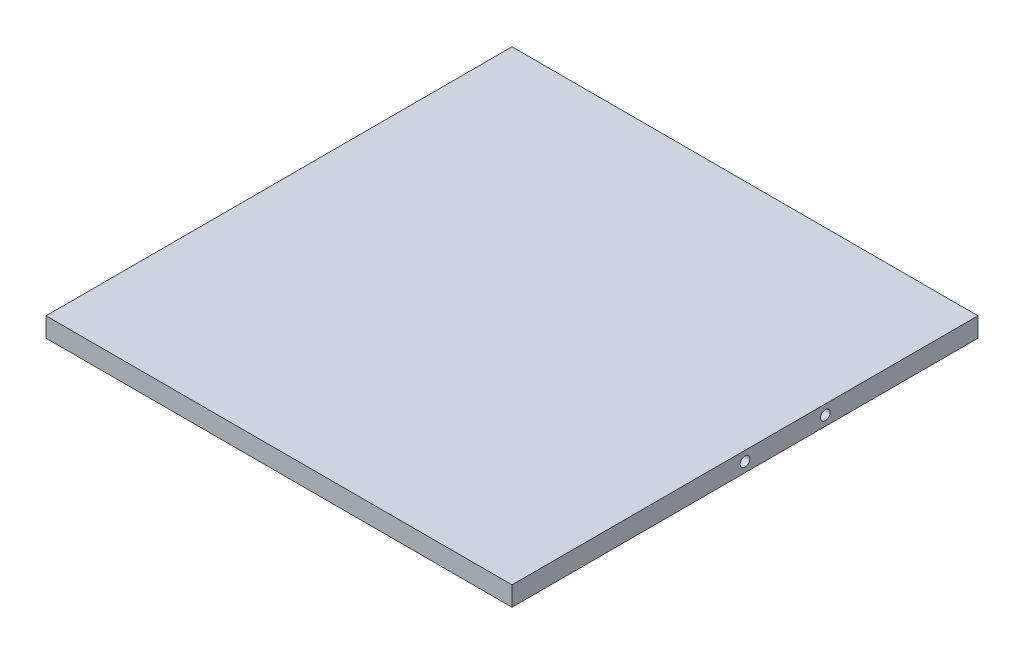
ISO-10303-21;
HEADER;
FILE_DESCRIPTION(('STEP AP214'),'2;1');
FILE_NAME('part.step','',(''),(''),'','','');
FILE_SCHEMA(('AUTOMOTIVE_DESIGN { 1 0 10303 214 1 1 1 1 }'));
ENDSEC;
DATA;
#1=APPLICATION_CONTEXT('core data for automotive mechanical design processes');
#2=APPLICATION_PROTOCOL_DEFINITION('international standard','automotive_design',2000,#1);
#3=PRODUCT_CONTEXT('',#1,'mechanical');
#4=PRODUCT('Part','Part','',(#3));
#5=PRODUCT_RELATED_PRODUCT_CATEGORY('part','',(#4));
#6=PRODUCT_DEFINITION_FORMATION('','',#4);
#7=PRODUCT_DEFINITION_CONTEXT('part definition',#1,'design');
#8=PRODUCT_DEFINITION('design','',#6,#7);
#9=PRODUCT_DEFINITION_SHAPE('','',#8);
#10=(LENGTH_UNIT() NAMED_UNIT(*) SI_UNIT(.MILLI.,.METRE.));
#11=(NAMED_UNIT(*) PLANE_ANGLE_UNIT() SI_UNIT($,.RADIAN.));
#12=(NAMED_UNIT(*) SI_UNIT($,.STERADIAN.) SOLID_ANGLE_UNIT());
#13=UNCERTAINTY_MEASURE_WITH_UNIT(LENGTH_MEASURE(1.E-05),#10,'distance_accuracy_value','');
#14=(GEOMETRIC_REPRESENTATION_CONTEXT(3) GLOBAL_UNCERTAINTY_ASSIGNED_CONTEXT((#13)) GLOBAL_UNIT_ASSIGNED_CONTEXT((#10,
#11,#12)) REPRESENTATION_CONTEXT('',''));
#15=CARTESIAN_POINT('',(0.,0.,0.));
#16=DIRECTION('',(0.,0.,1.));
#17=DIRECTION('',(1.,0.,0.));
#18=AXIS2_PLACEMENT_3D('',#15,#16,#17);
#19=CARTESIAN_POINT('',(-250.84019138756,12.7,-154.952153110048));
#20=DIRECTION('',(1.,0.,0.));
#21=DIRECTION('',(0.,0.,-1.));
#22=AXIS2_PLACEMENT_3D('',#19,#20,#21);
#23=PLANE('',#22);
#24=CARTESIAN_POINT('',(-250.84019138756,6.35,-55.1089825919136));
#25=DIRECTION('',(-1.,0.,0.));
#26=DIRECTION('',(0.,0.,1.));
#27=AXIS2_PLACEMENT_3D('',#24,#25,#26);
#28=CIRCLE('',#27,3.175);
#29=CARTESIAN_POINT('',(-250.84019138756,6.35,-51.9339825919136));
#30=VERTEX_POINT('',#29);
#31=EDGE_CURVE('E115',#30,#30,#28,.T.);
#32=ORIENTED_EDGE('',*,*,#31,.F.);
#33=EDGE_LOOP('',(#32));
#34=FACE_BOUND('',#33,.T.);
#35=CARTESIAN_POINT('',(-250.84019138756,6.35,-2.55215311004778));
#36=DIRECTION('',(1.,0.,0.));
#37=DIRECTION('',(0.,0.,-1.));
#38=AXIS2_PLACEMENT_3D('',#35,#36,#37);
#39=CIRCLE('',#38,3.175);
#40=CARTESIAN_POINT('',(-250.84019138756,6.35,-5.72715311004778));
#41=VERTEX_POINT('',#40);
#42=EDGE_CURVE('E98',#41,#41,#39,.T.);
#43=ORIENTED_EDGE('',*,*,#42,.T.);
#44=EDGE_LOOP('',(#43));
#45=FACE_BOUND('',#44,.T.);
#46=DIRECTION('',(0.,0.,1.));
#47=VECTOR('',#46,1.);
#48=CARTESIAN_POINT('',(-250.84019138756,0.,-154.952153110048));
#49=LINE('',#48,#47);
#50=CARTESIAN_POINT('',(-250.84019138756,0.,-154.952153110048));
#51=VERTEX_POINT('',#50);
#52=CARTESIAN_POINT('',(-250.84019138756,0.,149.847846889952));
#53=VERTEX_POINT('',#52);
#54=EDGE_CURVE('E95',#51,#53,#49,.T.);
#55=ORIENTED_EDGE('',*,*,#54,.T.);
#56=DIRECTION('',(0.,-1.,0.));
#57=VECTOR('',#56,1.);
#58=CARTESIAN_POINT('',(-250.84019138756,12.7,149.847846889952));
#59=LINE('',#58,#57);
#60=CARTESIAN_POINT('',(-250.84019138756,12.7,149.847846889952));
#61=VERTEX_POINT('',#60);
#62=EDGE_CURVE('E11',#61,#53,#59,.T.);
#63=ORIENTED_EDGE('',*,*,#62,.F.);
#64=DIRECTION('',(0.,0.,1.));
#65=VECTOR('',#64,1.);
#66=CARTESIAN_POINT('',(-250.84019138756,12.7,-154.952153110048));
#67=LINE('',#66,#65);
#68=CARTESIAN_POINT('',(-250.84019138756,12.7,-154.952153110048));
#69=VERTEX_POINT('',#68);
#70=EDGE_CURVE('E83',#69,#61,#67,.T.);
#71=ORIENTED_EDGE('',*,*,#70,.F.);
#72=DIRECTION('',(0.,-1.,0.));
#73=VECTOR('',#72,1.);
#74=CARTESIAN_POINT('',(-250.84019138756,12.7,-154.952153110048));
#75=LINE('',#74,#73);
#76=EDGE_CURVE('E91',#69,#51,#75,.T.);
#77=ORIENTED_EDGE('',*,*,#76,.T.);
#78=EDGE_LOOP('',(#55,#63,#71,#77));
#79=FACE_BOUND('',#78,.T.);
#80=ADVANCED_FACE('F32',(#34,#45,#79),#23,.F.);
#81=CARTESIAN_POINT('',(-250.84019138756,12.7,149.847846889952));
#82=DIRECTION('',(0.,0.,-1.));
#83=DIRECTION('',(-1.,0.,0.));
#84=AXIS2_PLACEMENT_3D('',#81,#82,#83);
#85=PLANE('',#84);
#86=DIRECTION('',(1.,0.,0.));
#87=VECTOR('',#86,1.);
#88=CARTESIAN_POINT('',(-250.84019138756,0.,149.847846889952));
#89=LINE('',#88,#87);
#90=CARTESIAN_POINT('',(53.9598086124403,0.,149.847846889952));
#91=VERTEX_POINT('',#90);
#92=EDGE_CURVE('E87',#53,#91,#89,.T.);
#93=ORIENTED_EDGE('',*,*,#92,.T.);
#94=DIRECTION('',(0.,-1.,0.));
#95=VECTOR('',#94,1.);
#96=CARTESIAN_POINT('',(53.9598086124403,12.7,149.847846889952));
#97=LINE('',#96,#95);
#98=CARTESIAN_POINT('',(53.9598086124403,12.7,149.847846889952));
#99=VERTEX_POINT('',#98);
#100=EDGE_CURVE('E40',#99,#91,#97,.T.);
#101=ORIENTED_EDGE('',*,*,#100,.F.);
#102=DIRECTION('',(1.,0.,0.));
#103=VECTOR('',#102,1.);
#104=CARTESIAN_POINT('',(-250.84019138756,12.7,149.847846889952));
#105=LINE('',#104,#103);
#106=EDGE_CURVE('E78',#61,#99,#105,.T.);
#107=ORIENTED_EDGE('',*,*,#106,.F.);
#108=ORIENTED_EDGE('',*,*,#62,.T.);
#109=EDGE_LOOP('',(#93,#101,#107,#108));
#110=FACE_BOUND('',#109,.T.);
#111=ADVANCED_FACE('F86',(#110),#85,.F.);
#112=CARTESIAN_POINT('',(53.9598086124403,12.7,-154.952153110048));
#113=DIRECTION('',(-1.,0.,0.));
#114=DIRECTION('',(0.,0.,1.));
#115=AXIS2_PLACEMENT_3D('',#112,#113,#114);
#116=PLANE('',#115);
#117=CARTESIAN_POINT('',(53.9598086124403,6.35,-55.1089825919136));
#118=DIRECTION('',(-1.,0.,0.));
#119=DIRECTION('',(0.,0.,1.));
#120=AXIS2_PLACEMENT_3D('',#117,#118,#119);
#121=CIRCLE('',#120,3.175);
#122=CARTESIAN_POINT('',(53.9598086124403,6.35,-51.9339825919136));
#123=VERTEX_POINT('',#122);
#124=EDGE_CURVE('E112',#123,#123,#121,.T.);
#125=ORIENTED_EDGE('',*,*,#124,.T.);
#126=EDGE_LOOP('',(#125));
#127=FACE_BOUND('',#126,.T.);
#128=CARTESIAN_POINT('',(53.9598086124403,6.35,-2.55215311004778));
#129=DIRECTION('',(1.,0.,0.));
#130=DIRECTION('',(0.,0.,-1.));
#131=AXIS2_PLACEMENT_3D('',#128,#129,#130);
#132=CIRCLE('',#131,3.175);
#133=CARTESIAN_POINT('',(53.9598086124403,6.35,-5.72715311004778));
#134=VERTEX_POINT('',#133);
#135=EDGE_CURVE('E109',#134,#134,#132,.T.);
#136=ORIENTED_EDGE('',*,*,#135,.F.);
#137=EDGE_LOOP('',(#136));
#138=FACE_BOUND('',#137,.T.);
#139=DIRECTION('',(0.,0.,-1.));
#140=VECTOR('',#139,1.);
#141=CARTESIAN_POINT('',(53.9598086124403,0.,-154.952153110048));
#142=LINE('',#141,#140);
#143=CARTESIAN_POINT('',(53.9598086124403,0.,-154.952153110048));
#144=VERTEX_POINT('',#143);
#145=EDGE_CURVE('E65',#91,#144,#142,.T.);
#146=ORIENTED_EDGE('',*,*,#145,.T.);
#147=DIRECTION('',(0.,-1.,0.));
#148=VECTOR('',#147,1.);
#149=CARTESIAN_POINT('',(53.9598086124403,12.7,-154.952153110048));
#150=LINE('',#149,#148);
#151=CARTESIAN_POINT('',(53.9598086124403,12.7,-154.952153110048));
#152=VERTEX_POINT('',#151);
#153=EDGE_CURVE('E88',#152,#144,#150,.T.);
#154=ORIENTED_EDGE('',*,*,#153,.F.);
#155=DIRECTION('',(0.,0.,-1.));
#156=VECTOR('',#155,1.);
#157=CARTESIAN_POINT('',(53.9598086124403,12.7,-154.952153110048));
#158=LINE('',#157,#156);
#159=EDGE_CURVE('E81',#99,#152,#158,.T.);
#160=ORIENTED_EDGE('',*,*,#159,.F.);
#161=ORIENTED_EDGE('',*,*,#100,.T.);
#162=EDGE_LOOP('',(#146,#154,#160,#161));
#163=FACE_BOUND('',#162,.T.);
#164=ADVANCED_FACE('F89',(#127,#138,#163),#116,.F.);
#165=CARTESIAN_POINT('',(-250.84019138756,12.7,-154.952153110048));
#166=DIRECTION('',(0.,0.,1.));
#167=DIRECTION('',(1.,0.,0.));
#168=AXIS2_PLACEMENT_3D('',#165,#166,#167);
#169=PLANE('',#168);
#170=DIRECTION('',(-1.,0.,0.));
#171=VECTOR('',#170,1.);
#172=CARTESIAN_POINT('',(-250.84019138756,0.,-154.952153110048));
#173=LINE('',#172,#171);
#174=EDGE_CURVE('E71',#144,#51,#173,.T.);
#175=ORIENTED_EDGE('',*,*,#174,.T.);
#176=ORIENTED_EDGE('',*,*,#76,.F.);
#177=DIRECTION('',(-1.,0.,0.));
#178=VECTOR('',#177,1.);
#179=CARTESIAN_POINT('',(-250.84019138756,12.7,-154.952153110048));
#180=LINE('',#179,#178);
#181=EDGE_CURVE('E48',#152,#69,#180,.T.);
#182=ORIENTED_EDGE('',*,*,#181,.F.);
#183=ORIENTED_EDGE('',*,*,#153,.T.);
#184=EDGE_LOOP('',(#175,#176,#182,#183));
#185=FACE_BOUND('',#184,.T.);
#186=ADVANCED_FACE('F103',(#185),#169,.F.);
#187=CARTESIAN_POINT('',(0.,12.7,0.));
#188=DIRECTION('',(0.,1.,0.));
#189=DIRECTION('',(0.,0.,1.));
#190=AXIS2_PLACEMENT_3D('',#187,#188,#189);
#191=PLANE('',#190);
#192=ORIENTED_EDGE('',*,*,#70,.T.);
#193=ORIENTED_EDGE('',*,*,#106,.T.);
#194=ORIENTED_EDGE('',*,*,#159,.T.);
#195=ORIENTED_EDGE('',*,*,#181,.T.);
#196=EDGE_LOOP('',(#192,#193,#194,#195));
#197=FACE_BOUND('',#196,.T.);
#198=ADVANCED_FACE('F79',(#197),#191,.T.);
#199=CARTESIAN_POINT('',(0.,0.,0.));
#200=DIRECTION('',(0.,1.,0.));
#201=DIRECTION('',(0.,0.,1.));
#202=AXIS2_PLACEMENT_3D('',#199,#200,#201);
#203=PLANE('',#202);
#204=ORIENTED_EDGE('',*,*,#54,.F.);
#205=ORIENTED_EDGE('',*,*,#174,.F.);
#206=ORIENTED_EDGE('',*,*,#145,.F.);
#207=ORIENTED_EDGE('',*,*,#92,.F.);
#208=EDGE_LOOP('',(#204,#205,#206,#207));
#209=FACE_BOUND('',#208,.T.);
#210=ADVANCED_FACE('F106',(#209),#203,.F.);
#211=CARTESIAN_POINT('',(-250.84019138756,6.35,-2.55215311004778));
#212=DIRECTION('',(1.,0.,0.));
#213=DIRECTION('',(0.,0.,-1.));
#214=AXIS2_PLACEMENT_3D('',#211,#212,#213);
#215=CYLINDRICAL_SURFACE('',#214,3.175);
#216=CARTESIAN_POINT('',(-250.84019138756,6.35,-5.72715311004778));
#217=CARTESIAN_POINT('',(-247.66519138756,6.35,-5.72715311004778));
#218=CARTESIAN_POINT('',(-244.49019138756,6.35,-5.72715311004778));
#219=CARTESIAN_POINT('',(-238.14019138756,6.35,-5.72715311004778));
#220=CARTESIAN_POINT('',(-234.96519138756,6.35,-5.72715311004778));
#221=CARTESIAN_POINT('',(-228.61519138756,6.35,-5.72715311004778));
#222=CARTESIAN_POINT('',(-225.44019138756,6.35,-5.72715311004778));
#223=CARTESIAN_POINT('',(-219.09019138756,6.35,-5.72715311004778));
#224=CARTESIAN_POINT('',(-215.91519138756,6.35,-5.72715311004778));
#225=CARTESIAN_POINT('',(-209.56519138756,6.35,-5.72715311004778));
#226=CARTESIAN_POINT('',(-206.39019138756,6.35,-5.72715311004778));
#227=CARTESIAN_POINT('',(-200.04019138756,6.35,-5.72715311004778));
#228=CARTESIAN_POINT('',(-196.86519138756,6.35,-5.72715311004778));
#229=CARTESIAN_POINT('',(-190.51519138756,6.35,-5.72715311004778));
#230=CARTESIAN_POINT('',(-187.34019138756,6.35,-5.72715311004778));
#231=CARTESIAN_POINT('',(-180.99019138756,6.35,-5.72715311004778));
#232=CARTESIAN_POINT('',(-177.81519138756,6.35,-5.72715311004778));
#233=CARTESIAN_POINT('',(-171.46519138756,6.35,-5.72715311004778));
#234=CARTESIAN_POINT('',(-168.29019138756,6.35,-5.72715311004778));
#235=CARTESIAN_POINT('',(-161.94019138756,6.35,-5.72715311004778));
#236=CARTESIAN_POINT('',(-158.76519138756,6.35,-5.72715311004778));
#237=CARTESIAN_POINT('',(-152.41519138756,6.35,-5.72715311004778));
#238=CARTESIAN_POINT('',(-149.24019138756,6.35,-5.72715311004778));
#239=CARTESIAN_POINT('',(-142.89019138756,6.35,-5.72715311004778));
#240=CARTESIAN_POINT('',(-139.71519138756,6.35,-5.72715311004778));
#241=CARTESIAN_POINT('',(-133.36519138756,6.35,-5.72715311004778));
#242=CARTESIAN_POINT('',(-130.19019138756,6.35,-5.72715311004778));
#243=CARTESIAN_POINT('',(-123.84019138756,6.35,-5.72715311004778));
#244=CARTESIAN_POINT('',(-120.66519138756,6.35,-5.72715311004778));
#245=CARTESIAN_POINT('',(-114.31519138756,6.35,-5.72715311004778));
#246=CARTESIAN_POINT('',(-111.14019138756,6.35,-5.72715311004778));
#247=CARTESIAN_POINT('',(-104.79019138756,6.35,-5.72715311004778));
#248=CARTESIAN_POINT('',(-101.61519138756,6.35,-5.72715311004778));
#249=CARTESIAN_POINT('',(-95.2651913875598,6.35,-5.72715311004778));
#250=CARTESIAN_POINT('',(-92.0901913875598,6.35,-5.72715311004778));
#251=CARTESIAN_POINT('',(-85.7401913875598,6.35,-5.72715311004778));
#252=CARTESIAN_POINT('',(-82.5651913875598,6.35,-5.72715311004778));
#253=CARTESIAN_POINT('',(-76.2151913875598,6.35,-5.72715311004778));
#254=CARTESIAN_POINT('',(-73.0401913875598,6.35,-5.72715311004778));
#255=CARTESIAN_POINT('',(-66.6901913875598,6.35,-5.72715311004778));
#256=CARTESIAN_POINT('',(-63.5151913875597,6.35,-5.72715311004778));
#257=CARTESIAN_POINT('',(-57.1651913875598,6.35,-5.72715311004778));
#258=CARTESIAN_POINT('',(-53.9901913875598,6.35,-5.72715311004778));
#259=CARTESIAN_POINT('',(-47.6401913875598,6.35,-5.72715311004778));
#260=CARTESIAN_POINT('',(-44.4651913875598,6.35,-5.72715311004778));
#261=CARTESIAN_POINT('',(-38.1151913875598,6.35,-5.72715311004778));
#262=CARTESIAN_POINT('',(-34.9401913875598,6.35,-5.72715311004778));
#263=CARTESIAN_POINT('',(-28.5901913875598,6.35,-5.72715311004778));
#264=CARTESIAN_POINT('',(-25.4151913875598,6.35,-5.72715311004778));
#265=CARTESIAN_POINT('',(-19.0651913875598,6.35,-5.72715311004778));
#266=CARTESIAN_POINT('',(-15.8901913875597,6.35,-5.72715311004778));
#267=CARTESIAN_POINT('',(-9.54019138755975,6.35,-5.72715311004778));
#268=CARTESIAN_POINT('',(-6.36519138755975,6.35,-5.72715311004778));
#269=CARTESIAN_POINT('',(-0.0151913875597507,6.35,-5.72715311004778));
#270=CARTESIAN_POINT('',(3.15980861244024,6.35,-5.72715311004778));
#271=CARTESIAN_POINT('',(9.50980861244024,6.35,-5.72715311004778));
#272=CARTESIAN_POINT('',(12.6848086124402,6.35,-5.72715311004778));
#273=CARTESIAN_POINT('',(19.0348086124402,6.35,-5.72715311004778));
#274=CARTESIAN_POINT('',(22.2098086124402,6.35,-5.72715311004778));
#275=CARTESIAN_POINT('',(28.5598086124402,6.35,-5.72715311004778));
#276=CARTESIAN_POINT('',(31.7348086124402,6.35,-5.72715311004778));
#277=CARTESIAN_POINT('',(38.0848086124403,6.35,-5.72715311004778));
#278=CARTESIAN_POINT('',(41.2598086124403,6.35,-5.72715311004778));
#279=CARTESIAN_POINT('',(47.6098086124403,6.35,-5.72715311004778));
#280=CARTESIAN_POINT('',(50.7848086124403,6.35,-5.72715311004778));
#281=CARTESIAN_POINT('',(53.9598086124403,6.35,-5.72715311004778));
#282=B_SPLINE_CURVE_WITH_KNOTS('',3,(#216,#217,#218,#219,#220,#221,#222,#223,#224,#225,#226,
#227,#228,#229,#230,#231,#232,#233,#234,#235,#236,#237,#238,#239,#240,#241,#242,#243,#244,#245,
#246,#247,#248,#249,#250,#251,#252,#253,#254,#255,#256,#257,#258,#259,#260,#261,#262,#263,#264,
#265,#266,#267,#268,#269,#270,#271,#272,#273,#274,#275,#276,#277,#278,#279,#280,#281),
.UNSPECIFIED.,.F.,.F.,(4,2,2,2,2,2,2,2,2,2,2,2,2,2,2,2,2,2,2,2,2,2,2,2,2,2,2,2,2,2,2,2,4),(0.,
9.52499999999998,19.05,28.575,38.1,47.625,57.15,66.675,76.2,85.725,95.25,104.775,114.3,123.825,
133.35,142.875,152.4,161.925,171.45,180.975,190.5,200.025,209.55,219.075,228.6,238.125,247.65,
257.175,266.7,276.225,285.75,295.275,304.8),.UNSPECIFIED.);
#283=EDGE_CURVE('BSEAM126',#41,#134,#282,.T.);
#284=ORIENTED_EDGE('',*,*,#42,.F.);
#285=ORIENTED_EDGE('',*,*,#135,.T.);
#286=ORIENTED_EDGE('',*,*,#283,.T.);
#287=ORIENTED_EDGE('',*,*,#283,.F.);
#288=EDGE_LOOP('',(#284,#286,#285,#287));
#289=FACE_BOUND('',#288,.T.);
#290=ADVANCED_FACE('F126',(#289),#215,.F.);
#291=CARTESIAN_POINT('',(53.9598086124403,6.35,-55.1089825919136));
#292=DIRECTION('',(-1.,0.,0.));
#293=DIRECTION('',(0.,0.,1.));
#294=AXIS2_PLACEMENT_3D('',#291,#292,#293);
#295=CYLINDRICAL_SURFACE('',#294,3.175);
#296=CARTESIAN_POINT('',(53.9598086124403,6.35,-51.9339825919136));
#297=CARTESIAN_POINT('',(50.7848086124403,6.35,-51.9339825919136));
#298=CARTESIAN_POINT('',(47.6098086124403,6.35,-51.9339825919136));
#299=CARTESIAN_POINT('',(41.2598086124403,6.35,-51.9339825919136));
#300=CARTESIAN_POINT('',(38.0848086124403,6.35,-51.9339825919136));
#301=CARTESIAN_POINT('',(31.7348086124403,6.35,-51.9339825919136));
#302=CARTESIAN_POINT('',(28.5598086124403,6.35,-51.9339825919136));
#303=CARTESIAN_POINT('',(22.2098086124403,6.35,-51.9339825919136));
#304=CARTESIAN_POINT('',(19.0348086124403,6.35,-51.9339825919136));
#305=CARTESIAN_POINT('',(12.6848086124403,6.35,-51.9339825919136));
#306=CARTESIAN_POINT('',(9.50980861244026,6.35,-51.9339825919136));
#307=CARTESIAN_POINT('',(3.15980861244026,6.35,-51.9339825919136));
#308=CARTESIAN_POINT('',(-0.0151913875597437,6.35,-51.9339825919136));
#309=CARTESIAN_POINT('',(-6.36519138755974,6.35,-51.9339825919136));
#310=CARTESIAN_POINT('',(-9.54019138755974,6.35,-51.9339825919136));
#311=CARTESIAN_POINT('',(-15.8901913875597,6.35,-51.9339825919136));
#312=CARTESIAN_POINT('',(-19.0651913875597,6.35,-51.9339825919136));
#313=CARTESIAN_POINT('',(-25.4151913875597,6.35,-51.9339825919136));
#314=CARTESIAN_POINT('',(-28.5901913875597,6.35,-51.9339825919136));
#315=CARTESIAN_POINT('',(-34.9401913875598,6.35,-51.9339825919136));
#316=CARTESIAN_POINT('',(-38.1151913875597,6.35,-51.9339825919136));
#317=CARTESIAN_POINT('',(-44.4651913875597,6.35,-51.9339825919136));
#318=CARTESIAN_POINT('',(-47.6401913875597,6.35,-51.9339825919136));
#319=CARTESIAN_POINT('',(-53.9901913875597,6.35,-51.9339825919136));
#320=CARTESIAN_POINT('',(-57.1651913875597,6.35,-51.9339825919136));
#321=CARTESIAN_POINT('',(-63.5151913875597,6.35,-51.9339825919136));
#322=CARTESIAN_POINT('',(-66.6901913875598,6.35,-51.9339825919136));
#323=CARTESIAN_POINT('',(-73.0401913875598,6.35,-51.9339825919136));
#324=CARTESIAN_POINT('',(-76.2151913875597,6.35,-51.9339825919136));
#325=CARTESIAN_POINT('',(-82.5651913875597,6.35,-51.9339825919136));
#326=CARTESIAN_POINT('',(-85.7401913875597,6.35,-51.9339825919136));
#327=CARTESIAN_POINT('',(-92.0901913875597,6.35,-51.9339825919136));
#328=CARTESIAN_POINT('',(-95.2651913875598,6.35,-51.9339825919136));
#329=CARTESIAN_POINT('',(-101.61519138756,6.35,-51.9339825919136));
#330=CARTESIAN_POINT('',(-104.79019138756,6.35,-51.9339825919136));
#331=CARTESIAN_POINT('',(-111.14019138756,6.35,-51.9339825919136));
#332=CARTESIAN_POINT('',(-114.31519138756,6.35,-51.9339825919136));
#333=CARTESIAN_POINT('',(-120.66519138756,6.35,-51.9339825919136));
#334=CARTESIAN_POINT('',(-123.84019138756,6.35,-51.9339825919136));
#335=CARTESIAN_POINT('',(-130.19019138756,6.35,-51.9339825919136));
#336=CARTESIAN_POINT('',(-133.36519138756,6.35,-51.9339825919136));
#337=CARTESIAN_POINT('',(-139.71519138756,6.35,-51.9339825919136));
#338=CARTESIAN_POINT('',(-142.89019138756,6.35,-51.9339825919136));
#339=CARTESIAN_POINT('',(-149.24019138756,6.35,-51.9339825919136));
#340=CARTESIAN_POINT('',(-152.41519138756,6.35,-51.9339825919136));
#341=CARTESIAN_POINT('',(-158.76519138756,6.35,-51.9339825919136));
#342=CARTESIAN_POINT('',(-161.94019138756,6.35,-51.9339825919136));
#343=CARTESIAN_POINT('',(-168.29019138756,6.35,-51.9339825919136));
#344=CARTESIAN_POINT('',(-171.46519138756,6.35,-51.9339825919136));
#345=CARTESIAN_POINT('',(-177.81519138756,6.35,-51.9339825919136));
#346=CARTESIAN_POINT('',(-180.99019138756,6.35,-51.9339825919136));
#347=CARTESIAN_POINT('',(-187.34019138756,6.35,-51.9339825919136));
#348=CARTESIAN_POINT('',(-190.51519138756,6.35,-51.9339825919136));
#349=CARTESIAN_POINT('',(-196.86519138756,6.35,-51.9339825919136));
#350=CARTESIAN_POINT('',(-200.04019138756,6.35,-51.9339825919136));
#351=CARTESIAN_POINT('',(-206.39019138756,6.35,-51.9339825919136));
#352=CARTESIAN_POINT('',(-209.56519138756,6.35,-51.9339825919136));
#353=CARTESIAN_POINT('',(-215.91519138756,6.35,-51.9339825919136));
#354=CARTESIAN_POINT('',(-219.09019138756,6.35,-51.9339825919136));
#355=CARTESIAN_POINT('',(-225.44019138756,6.35,-51.9339825919136));
#356=CARTESIAN_POINT('',(-228.61519138756,6.35,-51.9339825919136));
#357=CARTESIAN_POINT('',(-234.96519138756,6.35,-51.9339825919136));
#358=CARTESIAN_POINT('',(-238.14019138756,6.35,-51.9339825919136));
#359=CARTESIAN_POINT('',(-244.49019138756,6.35,-51.9339825919136));
#360=CARTESIAN_POINT('',(-247.66519138756,6.35,-51.9339825919136));
#361=CARTESIAN_POINT('',(-250.84019138756,6.35,-51.9339825919136));
#362=B_SPLINE_CURVE_WITH_KNOTS('',3,(#296,#297,#298,#299,#300,#301,#302,#303,#304,#305,#306,
#307,#308,#309,#310,#311,#312,#313,#314,#315,#316,#317,#318,#319,#320,#321,#322,#323,#324,#325,
#326,#327,#328,#329,#330,#331,#332,#333,#334,#335,#336,#337,#338,#339,#340,#341,#342,#343,#344,
#345,#346,#347,#348,#349,#350,#351,#352,#353,#354,#355,#356,#357,#358,#359,#360,#361),
.UNSPECIFIED.,.F.,.F.,(4,2,2,2,2,2,2,2,2,2,2,2,2,2,2,2,2,2,2,2,2,2,2,2,2,2,2,2,2,2,2,2,4),(0.,
9.525,19.05,28.575,38.1,47.625,57.15,66.675,76.2,85.725,95.25,104.775,114.3,123.825,133.35,
142.875,152.4,161.925,171.45,180.975,190.5,200.025,209.55,219.075,228.6,238.125,247.65,257.175,
266.7,276.225,285.75,295.275,304.8),.UNSPECIFIED.);
#363=EDGE_CURVE('BSEAM123',#123,#30,#362,.T.);
#364=ORIENTED_EDGE('',*,*,#124,.F.);
#365=ORIENTED_EDGE('',*,*,#31,.T.);
#366=ORIENTED_EDGE('',*,*,#363,.T.);
#367=ORIENTED_EDGE('',*,*,#363,.F.);
#368=EDGE_LOOP('',(#364,#366,#365,#367));
#369=FACE_BOUND('',#368,.T.);
#370=ADVANCED_FACE('F123',(#369),#295,.F.);
#371=CLOSED_SHELL('',(#80,#111,#164,#186,#198,#210,#290,#370));
#372=MANIFOLD_SOLID_BREP('B2',#371);
#373=ADVANCED_BREP_SHAPE_REPRESENTATION('',(#18,#372),#14);
#374=SHAPE_DEFINITION_REPRESENTATION(#9,#373);
ENDSEC;
END-ISO-10303-21;
